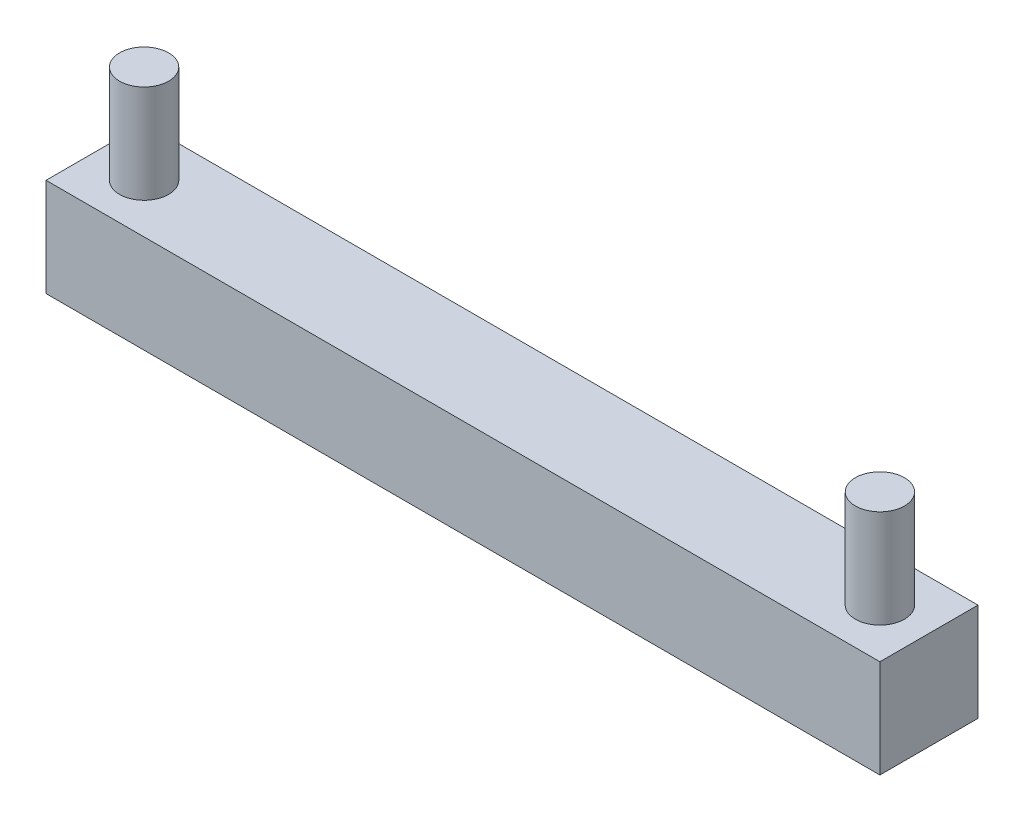
ISO-10303-21;
HEADER;
FILE_DESCRIPTION(('STEP AP214'),'2;1');
FILE_NAME('part.step','',(''),(''),'','','');
FILE_SCHEMA(('AUTOMOTIVE_DESIGN { 1 0 10303 214 1 1 1 1 }'));
ENDSEC;
DATA;
#1=APPLICATION_CONTEXT('core data for automotive mechanical design processes');
#2=APPLICATION_PROTOCOL_DEFINITION('international standard','automotive_design',2000,#1);
#3=PRODUCT_CONTEXT('',#1,'mechanical');
#4=PRODUCT('Part','Part','',(#3));
#5=PRODUCT_RELATED_PRODUCT_CATEGORY('part','',(#4));
#6=PRODUCT_DEFINITION_FORMATION('','',#4);
#7=PRODUCT_DEFINITION_CONTEXT('part definition',#1,'design');
#8=PRODUCT_DEFINITION('design','',#6,#7);
#9=PRODUCT_DEFINITION_SHAPE('','',#8);
#10=(LENGTH_UNIT() NAMED_UNIT(*) SI_UNIT(.MILLI.,.METRE.));
#11=(NAMED_UNIT(*) PLANE_ANGLE_UNIT() SI_UNIT($,.RADIAN.));
#12=(NAMED_UNIT(*) SI_UNIT($,.STERADIAN.) SOLID_ANGLE_UNIT());
#13=UNCERTAINTY_MEASURE_WITH_UNIT(LENGTH_MEASURE(1.E-05),#10,'distance_accuracy_value','');
#14=(GEOMETRIC_REPRESENTATION_CONTEXT(3) GLOBAL_UNCERTAINTY_ASSIGNED_CONTEXT((#13)) GLOBAL_UNIT_ASSIGNED_CONTEXT((#10,
#11,#12)) REPRESENTATION_CONTEXT('',''));
#15=CARTESIAN_POINT('',(0.,0.,0.));
#16=DIRECTION('',(0.,0.,1.));
#17=DIRECTION('',(1.,0.,0.));
#18=AXIS2_PLACEMENT_3D('',#15,#16,#17);
#19=CARTESIAN_POINT('',(0.,10.,0.));
#20=DIRECTION('',(1.,0.,0.));
#21=DIRECTION('',(0.,0.,-1.));
#22=AXIS2_PLACEMENT_3D('',#19,#20,#21);
#23=PLANE('',#22);
#24=DIRECTION('',(0.,0.,1.));
#25=VECTOR('',#24,1.);
#26=CARTESIAN_POINT('',(0.,0.,0.));
#27=LINE('',#26,#25);
#28=CARTESIAN_POINT('',(0.,0.,0.));
#29=VERTEX_POINT('',#28);
#30=CARTESIAN_POINT('',(0.,0.,10.));
#31=VERTEX_POINT('',#30);
#32=EDGE_CURVE('E95',#29,#31,#27,.T.);
#33=ORIENTED_EDGE('',*,*,#32,.T.);
#34=DIRECTION('',(0.,-1.,0.));
#35=VECTOR('',#34,1.);
#36=CARTESIAN_POINT('',(0.,10.,10.));
#37=LINE('',#36,#35);
#38=CARTESIAN_POINT('',(0.,10.,10.));
#39=VERTEX_POINT('',#38);
#40=EDGE_CURVE('E11',#39,#31,#37,.T.);
#41=ORIENTED_EDGE('',*,*,#40,.F.);
#42=DIRECTION('',(0.,0.,1.));
#43=VECTOR('',#42,1.);
#44=CARTESIAN_POINT('',(0.,10.,0.));
#45=LINE('',#44,#43);
#46=CARTESIAN_POINT('',(0.,10.,0.));
#47=VERTEX_POINT('',#46);
#48=EDGE_CURVE('E83',#47,#39,#45,.T.);
#49=ORIENTED_EDGE('',*,*,#48,.F.);
#50=DIRECTION('',(0.,-1.,0.));
#51=VECTOR('',#50,1.);
#52=CARTESIAN_POINT('',(0.,10.,0.));
#53=LINE('',#52,#51);
#54=EDGE_CURVE('E91',#47,#29,#53,.T.);
#55=ORIENTED_EDGE('',*,*,#54,.T.);
#56=EDGE_LOOP('',(#33,#41,#49,#55));
#57=FACE_BOUND('',#56,.T.);
#58=ADVANCED_FACE('F32',(#57),#23,.F.);
#59=CARTESIAN_POINT('',(0.,10.,10.));
#60=DIRECTION('',(0.,0.,-1.));
#61=DIRECTION('',(-1.,0.,0.));
#62=AXIS2_PLACEMENT_3D('',#59,#60,#61);
#63=PLANE('',#62);
#64=DIRECTION('',(1.,0.,0.));
#65=VECTOR('',#64,1.);
#66=CARTESIAN_POINT('',(0.,0.,10.));
#67=LINE('',#66,#65);
#68=CARTESIAN_POINT('',(85.,0.,9.99999999999998));
#69=VERTEX_POINT('',#68);
#70=EDGE_CURVE('E87',#31,#69,#67,.T.);
#71=ORIENTED_EDGE('',*,*,#70,.T.);
#72=DIRECTION('',(0.,-1.,0.));
#73=VECTOR('',#72,1.);
#74=CARTESIAN_POINT('',(85.,10.,9.99999999999998));
#75=LINE('',#74,#73);
#76=CARTESIAN_POINT('',(85.,10.,9.99999999999998));
#77=VERTEX_POINT('',#76);
#78=EDGE_CURVE('E40',#77,#69,#75,.T.);
#79=ORIENTED_EDGE('',*,*,#78,.F.);
#80=DIRECTION('',(1.,0.,0.));
#81=VECTOR('',#80,1.);
#82=CARTESIAN_POINT('',(0.,10.,10.));
#83=LINE('',#82,#81);
#84=EDGE_CURVE('E78',#39,#77,#83,.T.);
#85=ORIENTED_EDGE('',*,*,#84,.F.);
#86=ORIENTED_EDGE('',*,*,#40,.T.);
#87=EDGE_LOOP('',(#71,#79,#85,#86));
#88=FACE_BOUND('',#87,.T.);
#89=ADVANCED_FACE('F86',(#88),#63,.F.);
#90=CARTESIAN_POINT('',(85.,10.,0.));
#91=DIRECTION('',(-1.,0.,0.));
#92=DIRECTION('',(0.,0.,1.));
#93=AXIS2_PLACEMENT_3D('',#90,#91,#92);
#94=PLANE('',#93);
#95=DIRECTION('',(0.,0.,-1.));
#96=VECTOR('',#95,1.);
#97=CARTESIAN_POINT('',(85.,0.,0.));
#98=LINE('',#97,#96);
#99=CARTESIAN_POINT('',(85.,0.,0.));
#100=VERTEX_POINT('',#99);
#101=EDGE_CURVE('E65',#69,#100,#98,.T.);
#102=ORIENTED_EDGE('',*,*,#101,.T.);
#103=DIRECTION('',(0.,-1.,0.));
#104=VECTOR('',#103,1.);
#105=CARTESIAN_POINT('',(85.,10.,0.));
#106=LINE('',#105,#104);
#107=CARTESIAN_POINT('',(85.,10.,0.));
#108=VERTEX_POINT('',#107);
#109=EDGE_CURVE('E88',#108,#100,#106,.T.);
#110=ORIENTED_EDGE('',*,*,#109,.F.);
#111=DIRECTION('',(0.,0.,-1.));
#112=VECTOR('',#111,1.);
#113=CARTESIAN_POINT('',(85.,10.,0.));
#114=LINE('',#113,#112);
#115=EDGE_CURVE('E81',#77,#108,#114,.T.);
#116=ORIENTED_EDGE('',*,*,#115,.F.);
#117=ORIENTED_EDGE('',*,*,#78,.T.);
#118=EDGE_LOOP('',(#102,#110,#116,#117));
#119=FACE_BOUND('',#118,.T.);
#120=ADVANCED_FACE('F89',(#119),#94,.F.);
#121=CARTESIAN_POINT('',(0.,10.,0.));
#122=DIRECTION('',(0.,0.,1.));
#123=DIRECTION('',(1.,0.,0.));
#124=AXIS2_PLACEMENT_3D('',#121,#122,#123);
#125=PLANE('',#124);
#126=DIRECTION('',(-1.,0.,0.));
#127=VECTOR('',#126,1.);
#128=CARTESIAN_POINT('',(0.,0.,0.));
#129=LINE('',#128,#127);
#130=EDGE_CURVE('E71',#100,#29,#129,.T.);
#131=ORIENTED_EDGE('',*,*,#130,.T.);
#132=ORIENTED_EDGE('',*,*,#54,.F.);
#133=DIRECTION('',(-1.,0.,0.));
#134=VECTOR('',#133,1.);
#135=CARTESIAN_POINT('',(0.,10.,0.));
#136=LINE('',#135,#134);
#137=EDGE_CURVE('E48',#108,#47,#136,.T.);
#138=ORIENTED_EDGE('',*,*,#137,.F.);
#139=ORIENTED_EDGE('',*,*,#109,.T.);
#140=EDGE_LOOP('',(#131,#132,#138,#139));
#141=FACE_BOUND('',#140,.T.);
#142=ADVANCED_FACE('F103',(#141),#125,.F.);
#143=CARTESIAN_POINT('',(0.,10.,0.));
#144=DIRECTION('',(0.,1.,0.));
#145=DIRECTION('',(0.,0.,1.));
#146=AXIS2_PLACEMENT_3D('',#143,#144,#145);
#147=PLANE('',#146);
#148=CARTESIAN_POINT('',(80.,10.,4.99999999999999));
#149=DIRECTION('',(0.,1.,0.));
#150=DIRECTION('',(0.,0.,1.));
#151=AXIS2_PLACEMENT_3D('',#148,#149,#150);
#152=CIRCLE('',#151,2.50000000000001);
#153=CARTESIAN_POINT('',(80.,10.,7.5));
#154=VERTEX_POINT('',#153);
#155=EDGE_CURVE('E115',#154,#154,#152,.T.);
#156=ORIENTED_EDGE('',*,*,#155,.F.);
#157=EDGE_LOOP('',(#156));
#158=FACE_BOUND('',#157,.T.);
#159=CARTESIAN_POINT('',(5.,10.,4.99999999999999));
#160=DIRECTION('',(0.,1.,0.));
#161=DIRECTION('',(0.,0.,1.));
#162=AXIS2_PLACEMENT_3D('',#159,#160,#161);
#163=CIRCLE('',#162,2.5);
#164=CARTESIAN_POINT('',(5.,10.,7.49999999999999));
#165=VERTEX_POINT('',#164);
#166=EDGE_CURVE('E109',#165,#165,#163,.T.);
#167=ORIENTED_EDGE('',*,*,#166,.F.);
#168=EDGE_LOOP('',(#167));
#169=FACE_BOUND('',#168,.T.);
#170=ORIENTED_EDGE('',*,*,#48,.T.);
#171=ORIENTED_EDGE('',*,*,#84,.T.);
#172=ORIENTED_EDGE('',*,*,#115,.T.);
#173=ORIENTED_EDGE('',*,*,#137,.T.);
#174=EDGE_LOOP('',(#170,#171,#172,#173));
#175=FACE_BOUND('',#174,.T.);
#176=ADVANCED_FACE('F79',(#158,#169,#175),#147,.T.);
#177=CARTESIAN_POINT('',(0.,0.,0.));
#178=DIRECTION('',(0.,1.,0.));
#179=DIRECTION('',(0.,0.,1.));
#180=AXIS2_PLACEMENT_3D('',#177,#178,#179);
#181=PLANE('',#180);
#182=ORIENTED_EDGE('',*,*,#32,.F.);
#183=ORIENTED_EDGE('',*,*,#130,.F.);
#184=ORIENTED_EDGE('',*,*,#101,.F.);
#185=ORIENTED_EDGE('',*,*,#70,.F.);
#186=EDGE_LOOP('',(#182,#183,#184,#185));
#187=FACE_BOUND('',#186,.T.);
#188=ADVANCED_FACE('F106',(#187),#181,.F.);
#189=CARTESIAN_POINT('',(5.,20.,4.99999999999999));
#190=DIRECTION('',(0.,-1.,0.));
#191=DIRECTION('',(0.,0.,-1.));
#192=AXIS2_PLACEMENT_3D('',#189,#190,#191);
#193=CYLINDRICAL_SURFACE('',#192,2.5);
#194=CARTESIAN_POINT('',(5.,20.,4.99999999999999));
#195=DIRECTION('',(0.,1.,0.));
#196=DIRECTION('',(0.,0.,1.));
#197=AXIS2_PLACEMENT_3D('',#194,#195,#196);
#198=CIRCLE('',#197,2.5);
#199=CARTESIAN_POINT('',(5.,20.,7.49999999999999));
#200=VERTEX_POINT('',#199);
#201=EDGE_CURVE('E98',#200,#200,#198,.T.);
#202=ORIENTED_EDGE('',*,*,#201,.F.);
#203=EDGE_LOOP('',(#202));
#204=FACE_BOUND('',#203,.T.);
#205=ORIENTED_EDGE('',*,*,#166,.T.);
#206=EDGE_LOOP('',(#205));
#207=FACE_BOUND('',#206,.T.);
#208=ADVANCED_FACE('F135',(#204,#207),#193,.T.);
#209=CARTESIAN_POINT('',(5.,20.,4.99999999999999));
#210=DIRECTION('',(0.,1.,0.));
#211=DIRECTION('',(0.,0.,1.));
#212=AXIS2_PLACEMENT_3D('',#209,#210,#211);
#213=PLANE('',#212);
#214=ORIENTED_EDGE('',*,*,#201,.T.);
#215=EDGE_LOOP('',(#214));
#216=FACE_BOUND('',#215,.T.);
#217=ADVANCED_FACE('F126',(#216),#213,.T.);
#218=CARTESIAN_POINT('',(80.,20.,4.99999999999999));
#219=DIRECTION('',(0.,-1.,0.));
#220=DIRECTION('',(0.,0.,-1.));
#221=AXIS2_PLACEMENT_3D('',#218,#219,#220);
#222=CYLINDRICAL_SURFACE('',#221,2.50000000000001);
#223=CARTESIAN_POINT('',(80.,20.,4.99999999999999));
#224=DIRECTION('',(0.,1.,0.));
#225=DIRECTION('',(0.,0.,1.));
#226=AXIS2_PLACEMENT_3D('',#223,#224,#225);
#227=CIRCLE('',#226,2.50000000000001);
#228=CARTESIAN_POINT('',(80.,20.,7.5));
#229=VERTEX_POINT('',#228);
#230=EDGE_CURVE('E112',#229,#229,#227,.T.);
#231=ORIENTED_EDGE('',*,*,#230,.F.);
#232=EDGE_LOOP('',(#231));
#233=FACE_BOUND('',#232,.T.);
#234=ORIENTED_EDGE('',*,*,#155,.T.);
#235=EDGE_LOOP('',(#234));
#236=FACE_BOUND('',#235,.T.);
#237=ADVANCED_FACE('F123',(#233,#236),#222,.T.);
#238=CARTESIAN_POINT('',(80.,20.,4.99999999999999));
#239=DIRECTION('',(0.,1.,0.));
#240=DIRECTION('',(0.,0.,1.));
#241=AXIS2_PLACEMENT_3D('',#238,#239,#240);
#242=PLANE('',#241);
#243=ORIENTED_EDGE('',*,*,#230,.T.);
#244=EDGE_LOOP('',(#243));
#245=FACE_BOUND('',#244,.T.);
#246=ADVANCED_FACE('F121',(#245),#242,.T.);
#247=CLOSED_SHELL('',(#58,#89,#120,#142,#176,#188,#208,#217,#237,#246));
#248=MANIFOLD_SOLID_BREP('B2',#247);
#249=ADVANCED_BREP_SHAPE_REPRESENTATION('',(#18,#248),#14);
#250=SHAPE_DEFINITION_REPRESENTATION(#9,#249);
ENDSEC;
END-ISO-10303-21;
